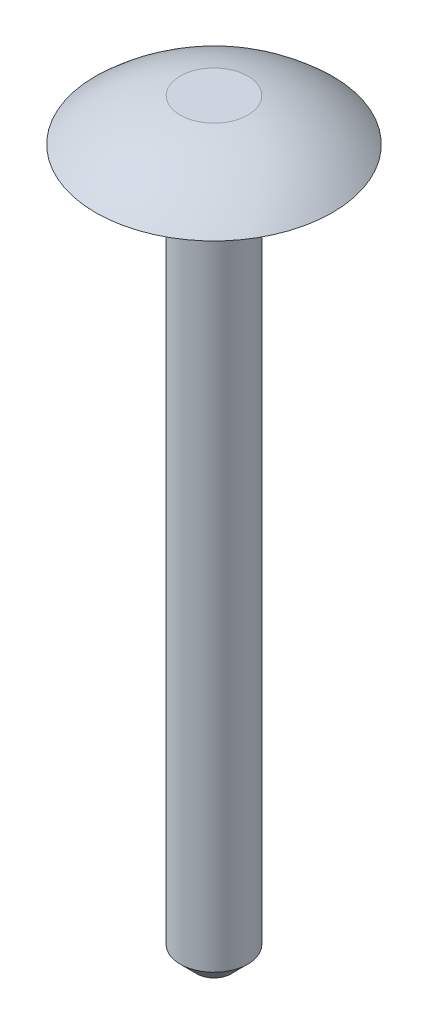
ISO-10303-21;
HEADER;
FILE_DESCRIPTION(('STEP AP214'),'2;1');
FILE_NAME('part.step','',(''),(''),'','','');
FILE_SCHEMA(('AUTOMOTIVE_DESIGN { 1 0 10303 214 1 1 1 1 }'));
ENDSEC;
DATA;
#1=APPLICATION_CONTEXT('core data for automotive mechanical design processes');
#2=APPLICATION_PROTOCOL_DEFINITION('international standard','automotive_design',2000,#1);
#3=PRODUCT_CONTEXT('',#1,'mechanical');
#4=PRODUCT('Part','Part','',(#3));
#5=PRODUCT_RELATED_PRODUCT_CATEGORY('part','',(#4));
#6=PRODUCT_DEFINITION_FORMATION('','',#4);
#7=PRODUCT_DEFINITION_CONTEXT('part definition',#1,'design');
#8=PRODUCT_DEFINITION('design','',#6,#7);
#9=PRODUCT_DEFINITION_SHAPE('','',#8);
#10=(LENGTH_UNIT() NAMED_UNIT(*) SI_UNIT(.MILLI.,.METRE.));
#11=(NAMED_UNIT(*) PLANE_ANGLE_UNIT() SI_UNIT($,.RADIAN.));
#12=(NAMED_UNIT(*) SI_UNIT($,.STERADIAN.) SOLID_ANGLE_UNIT());
#13=UNCERTAINTY_MEASURE_WITH_UNIT(LENGTH_MEASURE(1.E-05),#10,'distance_accuracy_value','');
#14=(GEOMETRIC_REPRESENTATION_CONTEXT(3) GLOBAL_UNCERTAINTY_ASSIGNED_CONTEXT((#13)) GLOBAL_UNIT_ASSIGNED_CONTEXT((#10,
#11,#12)) REPRESENTATION_CONTEXT('',''));
#15=CARTESIAN_POINT('',(0.,0.,0.));
#16=DIRECTION('',(0.,0.,1.));
#17=DIRECTION('',(1.,0.,0.));
#18=AXIS2_PLACEMENT_3D('',#15,#16,#17);
#19=CARTESIAN_POINT('',(0.,0.,0.));
#20=DIRECTION('',(0.,1.,0.));
#21=DIRECTION('',(0.,0.,1.));
#22=AXIS2_PLACEMENT_3D('',#19,#20,#21);
#23=PLANE('',#22);
#24=CARTESIAN_POINT('',(0.,0.,0.));
#25=DIRECTION('',(0.,1.,0.));
#26=DIRECTION('',(0.,0.,1.));
#27=AXIS2_PLACEMENT_3D('',#24,#25,#26);
#28=CIRCLE('',#27,2.99999999999999);
#29=CARTESIAN_POINT('',(0.,0.,2.99999999999999));
#30=VERTEX_POINT('',#29);
#31=EDGE_CURVE('E64',#30,#30,#28,.T.);
#32=ORIENTED_EDGE('',*,*,#31,.T.);
#33=EDGE_LOOP('',(#32));
#34=FACE_BOUND('',#33,.T.);
#35=CARTESIAN_POINT('',(0.,0.,0.));
#36=DIRECTION('',(0.,-1.,0.));
#37=DIRECTION('',(0.,0.,-1.));
#38=AXIS2_PLACEMENT_3D('',#35,#36,#37);
#39=CIRCLE('',#38,7.);
#40=CARTESIAN_POINT('',(0.,0.,-7.));
#41=VERTEX_POINT('',#40);
#42=EDGE_CURVE('E70',#41,#41,#39,.T.);
#43=ORIENTED_EDGE('',*,*,#42,.T.);
#44=EDGE_LOOP('',(#43));
#45=FACE_BOUND('',#44,.T.);
#46=ADVANCED_FACE('F45',(#34,#45),#23,.F.);
#47=CARTESIAN_POINT('',(-2.,2.5,0.));
#48=CARTESIAN_POINT('',(-4.8208651466786,1.97220079128278,0.));
#49=CARTESIAN_POINT('',(-7.,0.,0.));
#50=B_SPLINE_CURVE_WITH_KNOTS('',2,(#47,#48,#49),.UNSPECIFIED.,.F.,.F.,(3,3),(0.,1.),.UNSPECIFIED.);
#51=CARTESIAN_POINT('',(0.,0.,0.));
#52=DIRECTION('',(0.,-1.,0.));
#53=AXIS1_PLACEMENT('',#51,#52);
#54=SURFACE_OF_REVOLUTION('',#50,#53);
#55=ORIENTED_EDGE('',*,*,#42,.F.);
#56=EDGE_LOOP('',(#55));
#57=FACE_BOUND('',#56,.T.);
#58=CARTESIAN_POINT('',(0.,2.5,0.));
#59=DIRECTION('',(0.,-1.,0.));
#60=DIRECTION('',(0.,0.,-1.));
#61=AXIS2_PLACEMENT_3D('',#58,#59,#60);
#62=CIRCLE('',#61,2.);
#63=CARTESIAN_POINT('',(0.,2.5,-2.));
#64=VERTEX_POINT('',#63);
#65=EDGE_CURVE('E74',#64,#64,#62,.T.);
#66=ORIENTED_EDGE('',*,*,#65,.T.);
#67=EDGE_LOOP('',(#66));
#68=FACE_BOUND('',#67,.T.);
#69=ADVANCED_FACE('F85',(#57,#68),#54,.T.);
#70=CARTESIAN_POINT('',(0.,2.5,0.));
#71=DIRECTION('',(0.,-1.,0.));
#72=DIRECTION('',(0.,0.,-1.));
#73=AXIS2_PLACEMENT_3D('',#70,#71,#72);
#74=PLANE('',#73);
#75=ORIENTED_EDGE('',*,*,#65,.F.);
#76=EDGE_LOOP('',(#75));
#77=FACE_BOUND('',#76,.T.);
#78=ADVANCED_FACE('F89',(#77),#74,.F.);
#79=CARTESIAN_POINT('',(0.,-42.,0.));
#80=DIRECTION('',(0.,1.,0.));
#81=DIRECTION('',(0.,0.,1.));
#82=AXIS2_PLACEMENT_3D('',#79,#80,#81);
#83=CYLINDRICAL_SURFACE('',#82,2.);
#84=CARTESIAN_POINT('',(0.,-0.999999999999994,0.));
#85=DIRECTION('',(0.,1.,0.));
#86=DIRECTION('',(0.,0.,1.));
#87=AXIS2_PLACEMENT_3D('',#84,#85,#86);
#88=CIRCLE('',#87,2.);
#89=CARTESIAN_POINT('',(0.,-1.,2.));
#90=VERTEX_POINT('',#89);
#91=EDGE_CURVE('E54',#90,#90,#88,.F.);
#92=CARTESIAN_POINT('',(0.,-41.,0.));
#93=DIRECTION('',(0.,1.,0.));
#94=DIRECTION('',(0.,0.,1.));
#95=AXIS2_PLACEMENT_3D('',#92,#93,#94);
#96=CIRCLE('',#95,2.);
#97=CARTESIAN_POINT('',(0.,-41.,2.));
#98=VERTEX_POINT('',#97);
#99=EDGE_CURVE('E59',#98,#98,#96,.T.);
#100=CARTESIAN_POINT('',(0.,-1.,2.));
#101=CARTESIAN_POINT('',(0.,-1.41666666666667,2.));
#102=CARTESIAN_POINT('',(0.,-1.83333333333334,2.));
#103=CARTESIAN_POINT('',(0.,-2.66666666666667,2.));
#104=CARTESIAN_POINT('',(0.,-3.08333333333334,2.));
#105=CARTESIAN_POINT('',(0.,-3.91666666666667,2.));
#106=CARTESIAN_POINT('',(0.,-4.33333333333333,2.));
#107=CARTESIAN_POINT('',(0.,-5.16666666666666,2.));
#108=CARTESIAN_POINT('',(0.,-5.58333333333333,2.));
#109=CARTESIAN_POINT('',(0.,-6.41666666666667,2.));
#110=CARTESIAN_POINT('',(0.,-6.83333333333333,2.));
#111=CARTESIAN_POINT('',(0.,-7.66666666666667,2.));
#112=CARTESIAN_POINT('',(0.,-8.08333333333333,2.));
#113=CARTESIAN_POINT('',(0.,-8.91666666666667,2.));
#114=CARTESIAN_POINT('',(0.,-9.33333333333333,2.));
#115=CARTESIAN_POINT('',(0.,-10.1666666666667,2.));
#116=CARTESIAN_POINT('',(0.,-10.5833333333333,2.));
#117=CARTESIAN_POINT('',(0.,-11.4166666666667,2.));
#118=CARTESIAN_POINT('',(0.,-11.8333333333333,2.));
#119=CARTESIAN_POINT('',(0.,-12.6666666666667,2.));
#120=CARTESIAN_POINT('',(0.,-13.0833333333333,2.));
#121=CARTESIAN_POINT('',(0.,-13.9166666666667,2.));
#122=CARTESIAN_POINT('',(0.,-14.3333333333333,2.));
#123=CARTESIAN_POINT('',(0.,-15.1666666666667,2.));
#124=CARTESIAN_POINT('',(0.,-15.5833333333333,2.));
#125=CARTESIAN_POINT('',(0.,-16.4166666666667,2.));
#126=CARTESIAN_POINT('',(0.,-16.8333333333333,2.));
#127=CARTESIAN_POINT('',(0.,-17.6666666666667,2.));
#128=CARTESIAN_POINT('',(0.,-18.0833333333333,2.));
#129=CARTESIAN_POINT('',(0.,-18.9166666666667,2.));
#130=CARTESIAN_POINT('',(0.,-19.3333333333333,2.));
#131=CARTESIAN_POINT('',(0.,-20.1666666666667,2.));
#132=CARTESIAN_POINT('',(0.,-20.5833333333333,2.));
#133=CARTESIAN_POINT('',(0.,-21.4166666666667,2.));
#134=CARTESIAN_POINT('',(0.,-21.8333333333333,2.));
#135=CARTESIAN_POINT('',(0.,-22.6666666666667,2.));
#136=CARTESIAN_POINT('',(0.,-23.0833333333333,2.));
#137=CARTESIAN_POINT('',(0.,-23.9166666666667,2.));
#138=CARTESIAN_POINT('',(0.,-24.3333333333333,2.));
#139=CARTESIAN_POINT('',(0.,-25.1666666666667,2.));
#140=CARTESIAN_POINT('',(0.,-25.5833333333333,2.));
#141=CARTESIAN_POINT('',(0.,-26.4166666666667,2.));
#142=CARTESIAN_POINT('',(0.,-26.8333333333333,2.));
#143=CARTESIAN_POINT('',(0.,-27.6666666666667,2.));
#144=CARTESIAN_POINT('',(0.,-28.0833333333333,2.));
#145=CARTESIAN_POINT('',(0.,-28.9166666666667,2.));
#146=CARTESIAN_POINT('',(0.,-29.3333333333333,2.));
#147=CARTESIAN_POINT('',(0.,-30.1666666666667,2.));
#148=CARTESIAN_POINT('',(0.,-30.5833333333333,2.));
#149=CARTESIAN_POINT('',(0.,-31.4166666666667,2.));
#150=CARTESIAN_POINT('',(0.,-31.8333333333333,2.));
#151=CARTESIAN_POINT('',(0.,-32.6666666666667,2.));
#152=CARTESIAN_POINT('',(0.,-33.0833333333333,2.));
#153=CARTESIAN_POINT('',(0.,-33.9166666666667,2.));
#154=CARTESIAN_POINT('',(0.,-34.3333333333333,2.));
#155=CARTESIAN_POINT('',(0.,-35.1666666666667,2.));
#156=CARTESIAN_POINT('',(0.,-35.5833333333333,2.));
#157=CARTESIAN_POINT('',(0.,-36.4166666666667,2.));
#158=CARTESIAN_POINT('',(0.,-36.8333333333333,2.));
#159=CARTESIAN_POINT('',(0.,-37.6666666666667,2.));
#160=CARTESIAN_POINT('',(0.,-38.0833333333333,2.));
#161=CARTESIAN_POINT('',(0.,-38.9166666666667,2.));
#162=CARTESIAN_POINT('',(0.,-39.3333333333333,2.));
#163=CARTESIAN_POINT('',(0.,-40.1666666666667,2.));
#164=CARTESIAN_POINT('',(0.,-40.5833333333333,2.));
#165=CARTESIAN_POINT('',(0.,-41.,2.));
#166=B_SPLINE_CURVE_WITH_KNOTS('',3,(#100,#101,#102,#103,#104,#105,#106,#107,#108,#109,#110,
#111,#112,#113,#114,#115,#116,#117,#118,#119,#120,#121,#122,#123,#124,#125,#126,#127,#128,#129,
#130,#131,#132,#133,#134,#135,#136,#137,#138,#139,#140,#141,#142,#143,#144,#145,#146,#147,#148,
#149,#150,#151,#152,#153,#154,#155,#156,#157,#158,#159,#160,#161,#162,#163,#164,#165),
.UNSPECIFIED.,.F.,.F.,(4,2,2,2,2,2,2,2,2,2,2,2,2,2,2,2,2,2,2,2,2,2,2,2,2,2,2,2,2,2,2,2,4),(0.,
1.25,2.5,3.75,5.,6.25,7.5,8.75,9.99999999999999,11.25,12.5,13.75,15.,16.25,17.5,18.75,20.,21.25,
22.5,23.75,25.,26.25,27.5,28.75,30.,31.25,32.5,33.75,35.,36.25,37.5,38.75,40.),.UNSPECIFIED.);
#167=EDGE_CURVE('BSEAM106',#90,#98,#166,.T.);
#168=ORIENTED_EDGE('',*,*,#91,.T.);
#169=ORIENTED_EDGE('',*,*,#99,.T.);
#170=ORIENTED_EDGE('',*,*,#167,.T.);
#171=ORIENTED_EDGE('',*,*,#167,.F.);
#172=EDGE_LOOP('',(#168,#170,#169,#171));
#173=FACE_BOUND('',#172,.T.);
#174=ADVANCED_FACE('F106',(#173),#83,.T.);
#175=CARTESIAN_POINT('',(0.,-42.,0.));
#176=DIRECTION('',(0.,1.,0.));
#177=DIRECTION('',(0.,0.,1.));
#178=AXIS2_PLACEMENT_3D('',#175,#176,#177);
#179=PLANE('',#178);
#180=CARTESIAN_POINT('',(0.,-42.,0.));
#181=DIRECTION('',(0.,1.,0.));
#182=DIRECTION('',(0.,0.,1.));
#183=AXIS2_PLACEMENT_3D('',#180,#181,#182);
#184=CIRCLE('',#183,0.999999999999973);
#185=CARTESIAN_POINT('',(0.,-42.,0.999999999999973));
#186=VERTEX_POINT('',#185);
#187=EDGE_CURVE('E10',#186,#186,#184,.F.);
#188=ORIENTED_EDGE('',*,*,#187,.T.);
#189=EDGE_LOOP('',(#188));
#190=FACE_BOUND('',#189,.T.);
#191=ADVANCED_FACE('F99',(#190),#179,.F.);
#192=CARTESIAN_POINT('',(0.,0.,0.));
#193=DIRECTION('',(0.,1.,0.));
#194=DIRECTION('',(0.,0.,1.));
#195=AXIS2_PLACEMENT_3D('',#192,#193,#194);
#196=CONICAL_SURFACE('',#195,2.99999999999999,0.785398163397446);
#197=ORIENTED_EDGE('',*,*,#91,.F.);
#198=EDGE_LOOP('',(#197));
#199=FACE_BOUND('',#198,.T.);
#200=ORIENTED_EDGE('',*,*,#31,.F.);
#201=EDGE_LOOP('',(#200));
#202=FACE_BOUND('',#201,.T.);
#203=ADVANCED_FACE('F95',(#199,#202),#196,.T.);
#204=CARTESIAN_POINT('',(0.,-41.,0.));
#205=DIRECTION('',(0.,1.,0.));
#206=DIRECTION('',(0.,0.,1.));
#207=AXIS2_PLACEMENT_3D('',#204,#205,#206);
#208=CONICAL_SURFACE('',#207,2.,0.785398163397455);
#209=ORIENTED_EDGE('',*,*,#187,.F.);
#210=EDGE_LOOP('',(#209));
#211=FACE_BOUND('',#210,.T.);
#212=ORIENTED_EDGE('',*,*,#99,.F.);
#213=EDGE_LOOP('',(#212));
#214=FACE_BOUND('',#213,.T.);
#215=ADVANCED_FACE('F48',(#211,#214),#208,.T.);
#216=CLOSED_SHELL('',(#46,#69,#78,#174,#191,#203,#215));
#217=MANIFOLD_SOLID_BREP('B2',#216);
#218=ADVANCED_BREP_SHAPE_REPRESENTATION('',(#18,#217),#14);
#219=SHAPE_DEFINITION_REPRESENTATION(#9,#218);
ENDSEC;
END-ISO-10303-21;
